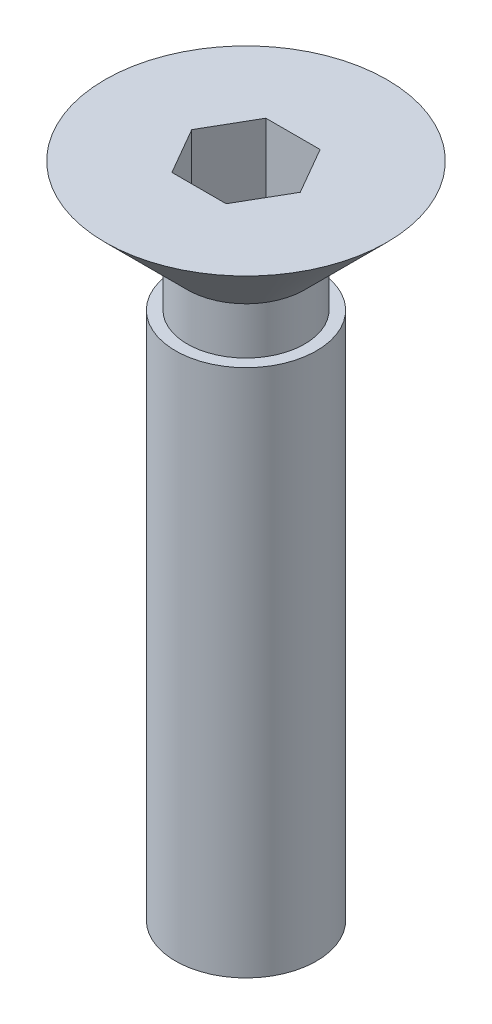
ISO-10303-21;
HEADER;
FILE_DESCRIPTION(('STEP AP214'),'2;1');
FILE_NAME('part.step','',(''),(''),'','','');
FILE_SCHEMA(('AUTOMOTIVE_DESIGN { 1 0 10303 214 1 1 1 1 }'));
ENDSEC;
DATA;
#1=APPLICATION_CONTEXT('core data for automotive mechanical design processes');
#2=APPLICATION_PROTOCOL_DEFINITION('international standard','automotive_design',2000,#1);
#3=PRODUCT_CONTEXT('',#1,'mechanical');
#4=PRODUCT('Part','Part','',(#3));
#5=PRODUCT_RELATED_PRODUCT_CATEGORY('part','',(#4));
#6=PRODUCT_DEFINITION_FORMATION('','',#4);
#7=PRODUCT_DEFINITION_CONTEXT('part definition',#1,'design');
#8=PRODUCT_DEFINITION('design','',#6,#7);
#9=PRODUCT_DEFINITION_SHAPE('','',#8);
#10=(LENGTH_UNIT() NAMED_UNIT(*) SI_UNIT(.MILLI.,.METRE.));
#11=(NAMED_UNIT(*) PLANE_ANGLE_UNIT() SI_UNIT($,.RADIAN.));
#12=(NAMED_UNIT(*) SI_UNIT($,.STERADIAN.) SOLID_ANGLE_UNIT());
#13=UNCERTAINTY_MEASURE_WITH_UNIT(LENGTH_MEASURE(1.E-05),#10,'distance_accuracy_value','');
#14=(GEOMETRIC_REPRESENTATION_CONTEXT(3) GLOBAL_UNCERTAINTY_ASSIGNED_CONTEXT((#13)) GLOBAL_UNIT_ASSIGNED_CONTEXT((#10,
#11,#12)) REPRESENTATION_CONTEXT('',''));
#15=CARTESIAN_POINT('',(0.,0.,0.));
#16=DIRECTION('',(0.,0.,1.));
#17=DIRECTION('',(1.,0.,0.));
#18=AXIS2_PLACEMENT_3D('',#15,#16,#17);
#19=CARTESIAN_POINT('',(0.,14.,0.));
#20=DIRECTION('',(0.,-1.,0.));
#21=DIRECTION('',(0.,0.,-1.));
#22=AXIS2_PLACEMENT_3D('',#19,#20,#21);
#23=PLANE('',#22);
#24=DIRECTION('',(-1.,0.,0.));
#25=VECTOR('',#24,1.);
#26=CARTESIAN_POINT('',(0.577350269189625,14.,-1.));
#27=LINE('',#26,#25);
#28=CARTESIAN_POINT('',(0.577350269189625,14.,-1.));
#29=VERTEX_POINT('',#28);
#30=CARTESIAN_POINT('',(-0.577350269189626,14.,-1.));
#31=VERTEX_POINT('',#30);
#32=EDGE_CURVE('E126',#29,#31,#27,.T.);
#33=ORIENTED_EDGE('',*,*,#32,.F.);
#34=DIRECTION('',(-0.5,0.,-0.866025403784438));
#35=VECTOR('',#34,1.);
#36=CARTESIAN_POINT('',(1.15470053837925,14.,0.));
#37=LINE('',#36,#35);
#38=CARTESIAN_POINT('',(1.15470053837925,14.,0.));
#39=VERTEX_POINT('',#38);
#40=EDGE_CURVE('E52',#39,#29,#37,.T.);
#41=ORIENTED_EDGE('',*,*,#40,.F.);
#42=DIRECTION('',(0.5,0.,-0.866025403784439));
#43=VECTOR('',#42,1.);
#44=CARTESIAN_POINT('',(0.577350269189626,14.,1.));
#45=LINE('',#44,#43);
#46=CARTESIAN_POINT('',(0.577350269189626,14.,1.));
#47=VERTEX_POINT('',#46);
#48=EDGE_CURVE('E135',#47,#39,#45,.T.);
#49=ORIENTED_EDGE('',*,*,#48,.F.);
#50=DIRECTION('',(1.,0.,0.));
#51=VECTOR('',#50,1.);
#52=CARTESIAN_POINT('',(-0.577350269189626,14.,1.));
#53=LINE('',#52,#51);
#54=CARTESIAN_POINT('',(-0.577350269189626,14.,1.));
#55=VERTEX_POINT('',#54);
#56=EDGE_CURVE('E133',#55,#47,#53,.T.);
#57=ORIENTED_EDGE('',*,*,#56,.F.);
#58=DIRECTION('',(0.5,0.,0.866025403784439));
#59=VECTOR('',#58,1.);
#60=CARTESIAN_POINT('',(-1.15470053837925,14.,0.));
#61=LINE('',#60,#59);
#62=CARTESIAN_POINT('',(-1.15470053837925,14.,0.));
#63=VERTEX_POINT('',#62);
#64=EDGE_CURVE('E100',#63,#55,#61,.T.);
#65=ORIENTED_EDGE('',*,*,#64,.F.);
#66=DIRECTION('',(-0.5,0.,0.866025403784438));
#67=VECTOR('',#66,1.);
#68=CARTESIAN_POINT('',(-0.577350269189626,14.,-1.));
#69=LINE('',#68,#67);
#70=EDGE_CURVE('E129',#31,#63,#69,.T.);
#71=ORIENTED_EDGE('',*,*,#70,.F.);
#72=EDGE_LOOP('',(#33,#41,#49,#57,#65,#71));
#73=FACE_BOUND('',#72,.T.);
#74=CARTESIAN_POINT('',(0.,14.,0.));
#75=DIRECTION('',(0.,-1.,0.));
#76=DIRECTION('',(0.,0.,-1.));
#77=AXIS2_PLACEMENT_3D('',#74,#75,#76);
#78=CIRCLE('',#77,3.);
#79=CARTESIAN_POINT('',(0.,14.,-3.));
#80=VERTEX_POINT('',#79);
#81=EDGE_CURVE('E11',#80,#80,#78,.T.);
#82=ORIENTED_EDGE('',*,*,#81,.F.);
#83=EDGE_LOOP('',(#82));
#84=FACE_BOUND('',#83,.T.);
#85=ADVANCED_FACE('F38',(#73,#84),#23,.F.);
#86=CARTESIAN_POINT('',(0.,14.,0.));
#87=DIRECTION('',(0.,1.,0.));
#88=DIRECTION('',(0.,0.,1.));
#89=AXIS2_PLACEMENT_3D('',#86,#87,#88);
#90=CONICAL_SURFACE('',#89,3.,0.785398163397454);
#91=CARTESIAN_POINT('',(0.,12.25,0.));
#92=DIRECTION('',(0.,-1.,0.));
#93=DIRECTION('',(0.,0.,-1.));
#94=AXIS2_PLACEMENT_3D('',#91,#92,#93);
#95=CIRCLE('',#94,1.25);
#96=CARTESIAN_POINT('',(0.,12.25,-1.25));
#97=VERTEX_POINT('',#96);
#98=EDGE_CURVE('E45',#97,#97,#95,.T.);
#99=ORIENTED_EDGE('',*,*,#98,.F.);
#100=EDGE_LOOP('',(#99));
#101=FACE_BOUND('',#100,.T.);
#102=ORIENTED_EDGE('',*,*,#81,.T.);
#103=EDGE_LOOP('',(#102));
#104=FACE_BOUND('',#103,.T.);
#105=ADVANCED_FACE('F157',(#101,#104),#90,.T.);
#106=CARTESIAN_POINT('',(0.,0.,0.));
#107=DIRECTION('',(0.,-1.,0.));
#108=DIRECTION('',(0.,0.,-1.));
#109=AXIS2_PLACEMENT_3D('',#106,#107,#108);
#110=CYLINDRICAL_SURFACE('',#109,1.25);
#111=CARTESIAN_POINT('',(0.,11.25,0.));
#112=DIRECTION('',(0.,-1.,0.));
#113=DIRECTION('',(0.,0.,-1.));
#114=AXIS2_PLACEMENT_3D('',#111,#112,#113);
#115=CIRCLE('',#114,1.25);
#116=CARTESIAN_POINT('',(0.,11.25,-1.25));
#117=VERTEX_POINT('',#116);
#118=EDGE_CURVE('E150',#117,#117,#115,.T.);
#119=ORIENTED_EDGE('',*,*,#118,.F.);
#120=EDGE_LOOP('',(#119));
#121=FACE_BOUND('',#120,.T.);
#122=ORIENTED_EDGE('',*,*,#98,.T.);
#123=EDGE_LOOP('',(#122));
#124=FACE_BOUND('',#123,.T.);
#125=ADVANCED_FACE('F155',(#121,#124),#110,.T.);
#126=CARTESIAN_POINT('',(-1.25,11.25,0.));
#127=DIRECTION('',(0.,-1.,0.));
#128=DIRECTION('',(0.,0.,-1.));
#129=AXIS2_PLACEMENT_3D('',#126,#127,#128);
#130=PLANE('',#129);
#131=CARTESIAN_POINT('',(0.,11.25,0.));
#132=DIRECTION('',(0.,-1.,0.));
#133=DIRECTION('',(0.,0.,-1.));
#134=AXIS2_PLACEMENT_3D('',#131,#132,#133);
#135=CIRCLE('',#134,1.5);
#136=CARTESIAN_POINT('',(0.,11.25,-1.5));
#137=VERTEX_POINT('',#136);
#138=EDGE_CURVE('E147',#137,#137,#135,.T.);
#139=ORIENTED_EDGE('',*,*,#138,.F.);
#140=EDGE_LOOP('',(#139));
#141=FACE_BOUND('',#140,.T.);
#142=ORIENTED_EDGE('',*,*,#118,.T.);
#143=EDGE_LOOP('',(#142));
#144=FACE_BOUND('',#143,.T.);
#145=ADVANCED_FACE('F190',(#141,#144),#130,.F.);
#146=CARTESIAN_POINT('',(0.,0.,0.));
#147=DIRECTION('',(0.,-1.,0.));
#148=DIRECTION('',(0.,0.,-1.));
#149=AXIS2_PLACEMENT_3D('',#146,#147,#148);
#150=CYLINDRICAL_SURFACE('',#149,1.5);
#151=CARTESIAN_POINT('',(0.,0.,0.));
#152=DIRECTION('',(0.,-1.,0.));
#153=DIRECTION('',(0.,0.,-1.));
#154=AXIS2_PLACEMENT_3D('',#151,#152,#153);
#155=CIRCLE('',#154,1.5);
#156=CARTESIAN_POINT('',(0.,0.,-1.5));
#157=VERTEX_POINT('',#156);
#158=EDGE_CURVE('E139',#157,#157,#155,.T.);
#159=ORIENTED_EDGE('',*,*,#158,.F.);
#160=EDGE_LOOP('',(#159));
#161=FACE_BOUND('',#160,.T.);
#162=ORIENTED_EDGE('',*,*,#138,.T.);
#163=EDGE_LOOP('',(#162));
#164=FACE_BOUND('',#163,.T.);
#165=ADVANCED_FACE('F182',(#161,#164),#150,.T.);
#166=CARTESIAN_POINT('',(-1.5,0.,0.));
#167=DIRECTION('',(0.,1.,0.));
#168=DIRECTION('',(0.,0.,1.));
#169=AXIS2_PLACEMENT_3D('',#166,#167,#168);
#170=PLANE('',#169);
#171=ORIENTED_EDGE('',*,*,#158,.T.);
#172=EDGE_LOOP('',(#171));
#173=FACE_BOUND('',#172,.T.);
#174=ADVANCED_FACE('F175',(#173),#170,.F.);
#175=CARTESIAN_POINT('',(1.15470053837925,12.,0.));
#176=DIRECTION('',(0.866025403784439,0.,-0.5));
#177=DIRECTION('',(-0.5,0.,-0.866025403784438));
#178=AXIS2_PLACEMENT_3D('',#175,#176,#177);
#179=PLANE('',#178);
#180=ORIENTED_EDGE('',*,*,#40,.T.);
#181=DIRECTION('',(0.,1.,0.));
#182=VECTOR('',#181,1.);
#183=CARTESIAN_POINT('',(0.577350269189625,12.,-1.));
#184=LINE('',#183,#182);
#185=CARTESIAN_POINT('',(0.577350269189625,12.,-1.));
#186=VERTEX_POINT('',#185);
#187=EDGE_CURVE('E82',#186,#29,#184,.T.);
#188=ORIENTED_EDGE('',*,*,#187,.F.);
#189=DIRECTION('',(-0.5,0.,-0.866025403784438));
#190=VECTOR('',#189,1.);
#191=CARTESIAN_POINT('',(1.15470053837925,12.,0.));
#192=LINE('',#191,#190);
#193=CARTESIAN_POINT('',(1.15470053837925,12.,0.));
#194=VERTEX_POINT('',#193);
#195=EDGE_CURVE('E137',#194,#186,#192,.T.);
#196=ORIENTED_EDGE('',*,*,#195,.F.);
#197=DIRECTION('',(0.,1.,0.));
#198=VECTOR('',#197,1.);
#199=CARTESIAN_POINT('',(1.15470053837925,12.,0.));
#200=LINE('',#199,#198);
#201=EDGE_CURVE('E60',#194,#39,#200,.T.);
#202=ORIENTED_EDGE('',*,*,#201,.T.);
#203=EDGE_LOOP('',(#180,#188,#196,#202));
#204=FACE_BOUND('',#203,.T.);
#205=ADVANCED_FACE('F172',(#204),#179,.F.);
#206=CARTESIAN_POINT('',(0.577350269189626,12.,1.));
#207=DIRECTION('',(0.866025403784439,0.,0.5));
#208=DIRECTION('',(0.5,0.,-0.866025403784439));
#209=AXIS2_PLACEMENT_3D('',#206,#207,#208);
#210=PLANE('',#209);
#211=ORIENTED_EDGE('',*,*,#48,.T.);
#212=ORIENTED_EDGE('',*,*,#201,.F.);
#213=DIRECTION('',(0.5,0.,-0.866025403784439));
#214=VECTOR('',#213,1.);
#215=CARTESIAN_POINT('',(0.577350269189626,12.,1.));
#216=LINE('',#215,#214);
#217=CARTESIAN_POINT('',(0.577350269189626,12.,1.));
#218=VERTEX_POINT('',#217);
#219=EDGE_CURVE('E112',#218,#194,#216,.T.);
#220=ORIENTED_EDGE('',*,*,#219,.F.);
#221=DIRECTION('',(0.,1.,0.));
#222=VECTOR('',#221,1.);
#223=CARTESIAN_POINT('',(0.577350269189626,12.,1.));
#224=LINE('',#223,#222);
#225=EDGE_CURVE('E104',#218,#47,#224,.T.);
#226=ORIENTED_EDGE('',*,*,#225,.T.);
#227=EDGE_LOOP('',(#211,#212,#220,#226));
#228=FACE_BOUND('',#227,.T.);
#229=ADVANCED_FACE('F174',(#228),#210,.F.);
#230=CARTESIAN_POINT('',(-0.577350269189626,12.,1.));
#231=DIRECTION('',(0.,0.,1.));
#232=DIRECTION('',(1.,0.,0.));
#233=AXIS2_PLACEMENT_3D('',#230,#231,#232);
#234=PLANE('',#233);
#235=ORIENTED_EDGE('',*,*,#56,.T.);
#236=ORIENTED_EDGE('',*,*,#225,.F.);
#237=DIRECTION('',(1.,0.,0.));
#238=VECTOR('',#237,1.);
#239=CARTESIAN_POINT('',(-0.577350269189626,12.,1.));
#240=LINE('',#239,#238);
#241=CARTESIAN_POINT('',(-0.577350269189626,12.,1.));
#242=VERTEX_POINT('',#241);
#243=EDGE_CURVE('E108',#242,#218,#240,.T.);
#244=ORIENTED_EDGE('',*,*,#243,.F.);
#245=DIRECTION('',(0.,1.,0.));
#246=VECTOR('',#245,1.);
#247=CARTESIAN_POINT('',(-0.577350269189626,12.,1.));
#248=LINE('',#247,#246);
#249=EDGE_CURVE('E93',#242,#55,#248,.T.);
#250=ORIENTED_EDGE('',*,*,#249,.T.);
#251=EDGE_LOOP('',(#235,#236,#244,#250));
#252=FACE_BOUND('',#251,.T.);
#253=ADVANCED_FACE('F109',(#252),#234,.F.);
#254=CARTESIAN_POINT('',(-1.15470053837925,12.,0.));
#255=DIRECTION('',(-0.866025403784439,0.,0.5));
#256=DIRECTION('',(0.5,0.,0.866025403784439));
#257=AXIS2_PLACEMENT_3D('',#254,#255,#256);
#258=PLANE('',#257);
#259=ORIENTED_EDGE('',*,*,#64,.T.);
#260=ORIENTED_EDGE('',*,*,#249,.F.);
#261=DIRECTION('',(0.5,0.,0.866025403784439));
#262=VECTOR('',#261,1.);
#263=CARTESIAN_POINT('',(-1.15470053837925,12.,0.));
#264=LINE('',#263,#262);
#265=CARTESIAN_POINT('',(-1.15470053837925,12.,0.));
#266=VERTEX_POINT('',#265);
#267=EDGE_CURVE('E97',#266,#242,#264,.T.);
#268=ORIENTED_EDGE('',*,*,#267,.F.);
#269=DIRECTION('',(0.,1.,0.));
#270=VECTOR('',#269,1.);
#271=CARTESIAN_POINT('',(-1.15470053837925,12.,0.));
#272=LINE('',#271,#270);
#273=EDGE_CURVE('E105',#266,#63,#272,.T.);
#274=ORIENTED_EDGE('',*,*,#273,.T.);
#275=EDGE_LOOP('',(#259,#260,#268,#274));
#276=FACE_BOUND('',#275,.T.);
#277=ADVANCED_FACE('F95',(#276),#258,.F.);
#278=CARTESIAN_POINT('',(-0.577350269189626,12.,-1.));
#279=DIRECTION('',(-0.866025403784439,0.,-0.5));
#280=DIRECTION('',(-0.5,0.,0.866025403784439));
#281=AXIS2_PLACEMENT_3D('',#278,#279,#280);
#282=PLANE('',#281);
#283=ORIENTED_EDGE('',*,*,#70,.T.);
#284=ORIENTED_EDGE('',*,*,#273,.F.);
#285=DIRECTION('',(-0.5,0.,0.866025403784438));
#286=VECTOR('',#285,1.);
#287=CARTESIAN_POINT('',(-0.577350269189626,12.,-1.));
#288=LINE('',#287,#286);
#289=CARTESIAN_POINT('',(-0.577350269189626,12.,-1.));
#290=VERTEX_POINT('',#289);
#291=EDGE_CURVE('E118',#290,#266,#288,.T.);
#292=ORIENTED_EDGE('',*,*,#291,.F.);
#293=DIRECTION('',(0.,1.,0.));
#294=VECTOR('',#293,1.);
#295=CARTESIAN_POINT('',(-0.577350269189626,12.,-1.));
#296=LINE('',#295,#294);
#297=EDGE_CURVE('E142',#290,#31,#296,.T.);
#298=ORIENTED_EDGE('',*,*,#297,.T.);
#299=EDGE_LOOP('',(#283,#284,#292,#298));
#300=FACE_BOUND('',#299,.T.);
#301=ADVANCED_FACE('F249',(#300),#282,.F.);
#302=CARTESIAN_POINT('',(0.577350269189625,12.,-1.));
#303=DIRECTION('',(0.,0.,-1.));
#304=DIRECTION('',(-1.,0.,0.));
#305=AXIS2_PLACEMENT_3D('',#302,#303,#304);
#306=PLANE('',#305);
#307=ORIENTED_EDGE('',*,*,#32,.T.);
#308=ORIENTED_EDGE('',*,*,#297,.F.);
#309=DIRECTION('',(-1.,0.,0.));
#310=VECTOR('',#309,1.);
#311=CARTESIAN_POINT('',(0.577350269189625,12.,-1.));
#312=LINE('',#311,#310);
#313=EDGE_CURVE('E120',#186,#290,#312,.T.);
#314=ORIENTED_EDGE('',*,*,#313,.F.);
#315=ORIENTED_EDGE('',*,*,#187,.T.);
#316=EDGE_LOOP('',(#307,#308,#314,#315));
#317=FACE_BOUND('',#316,.T.);
#318=ADVANCED_FACE('F170',(#317),#306,.F.);
#319=CARTESIAN_POINT('',(0.,12.,0.));
#320=DIRECTION('',(0.,1.,0.));
#321=DIRECTION('',(0.,0.,1.));
#322=AXIS2_PLACEMENT_3D('',#319,#320,#321);
#323=PLANE('',#322);
#324=ORIENTED_EDGE('',*,*,#195,.T.);
#325=ORIENTED_EDGE('',*,*,#313,.T.);
#326=ORIENTED_EDGE('',*,*,#291,.T.);
#327=ORIENTED_EDGE('',*,*,#267,.T.);
#328=ORIENTED_EDGE('',*,*,#243,.T.);
#329=ORIENTED_EDGE('',*,*,#219,.T.);
#330=EDGE_LOOP('',(#324,#325,#326,#327,#328,#329));
#331=FACE_BOUND('',#330,.T.);
#332=ADVANCED_FACE('F115',(#331),#323,.T.);
#333=CLOSED_SHELL('',(#85,#105,#125,#145,#165,#174,#205,#229,#253,#277,#301,#318,#332));
#334=MANIFOLD_SOLID_BREP('B2',#333);
#335=ADVANCED_BREP_SHAPE_REPRESENTATION('',(#18,#334),#14);
#336=SHAPE_DEFINITION_REPRESENTATION(#9,#335);
ENDSEC;
END-ISO-10303-21;
